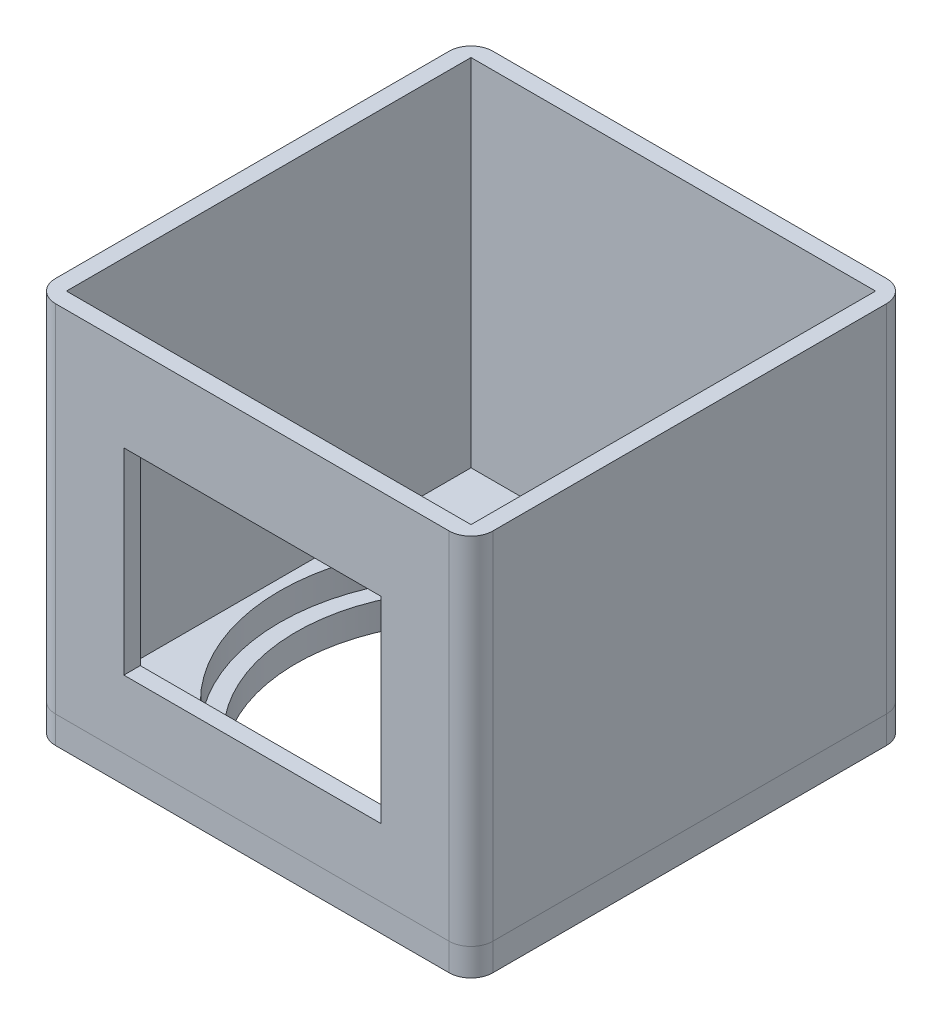
ISO-10303-21;
HEADER;
FILE_DESCRIPTION(('STEP AP214'),'2;1');
FILE_NAME('part.step','',(''),(''),'','','');
FILE_SCHEMA(('AUTOMOTIVE_DESIGN { 1 0 10303 214 1 1 1 1 }'));
ENDSEC;
DATA;
#1=APPLICATION_CONTEXT('core data for automotive mechanical design processes');
#2=APPLICATION_PROTOCOL_DEFINITION('international standard','automotive_design',2000,#1);
#3=PRODUCT_CONTEXT('',#1,'mechanical');
#4=PRODUCT('Part','Part','',(#3));
#5=PRODUCT_RELATED_PRODUCT_CATEGORY('part','',(#4));
#6=PRODUCT_DEFINITION_FORMATION('','',#4);
#7=PRODUCT_DEFINITION_CONTEXT('part definition',#1,'design');
#8=PRODUCT_DEFINITION('design','',#6,#7);
#9=PRODUCT_DEFINITION_SHAPE('','',#8);
#10=(LENGTH_UNIT() NAMED_UNIT(*) SI_UNIT(.MILLI.,.METRE.));
#11=(NAMED_UNIT(*) PLANE_ANGLE_UNIT() SI_UNIT($,.RADIAN.));
#12=(NAMED_UNIT(*) SI_UNIT($,.STERADIAN.) SOLID_ANGLE_UNIT());
#13=UNCERTAINTY_MEASURE_WITH_UNIT(LENGTH_MEASURE(1.E-05),#10,'distance_accuracy_value','');
#14=(GEOMETRIC_REPRESENTATION_CONTEXT(3) GLOBAL_UNCERTAINTY_ASSIGNED_CONTEXT((#13)) GLOBAL_UNIT_ASSIGNED_CONTEXT((#10,
#11,#12)) REPRESENTATION_CONTEXT('',''));
#15=CARTESIAN_POINT('',(0.,0.,0.));
#16=DIRECTION('',(0.,0.,1.));
#17=DIRECTION('',(1.,0.,0.));
#18=AXIS2_PLACEMENT_3D('',#15,#16,#17);
#19=CARTESIAN_POINT('',(0.,75.,0.));
#20=DIRECTION('',(0.,1.,0.));
#21=DIRECTION('',(0.,0.,1.));
#22=AXIS2_PLACEMENT_3D('',#19,#20,#21);
#23=PLANE('',#22);
#24=DIRECTION('',(1.,0.,0.));
#25=VECTOR('',#24,1.);
#26=CARTESIAN_POINT('',(-40.,75.,40.));
#27=LINE('',#26,#25);
#28=CARTESIAN_POINT('',(-36.,75.,40.));
#29=VERTEX_POINT('',#28);
#30=CARTESIAN_POINT('',(36.,75.,40.));
#31=VERTEX_POINT('',#30);
#32=EDGE_CURVE('E271',#29,#31,#27,.T.);
#33=ORIENTED_EDGE('',*,*,#32,.T.);
#34=CARTESIAN_POINT('',(36.,75.,36.));
#35=DIRECTION('',(0.,1.,0.));
#36=DIRECTION('',(0.,0.,1.));
#37=AXIS2_PLACEMENT_3D('',#34,#35,#36);
#38=CIRCLE('',#37,4.);
#39=CARTESIAN_POINT('',(40.,75.,36.));
#40=VERTEX_POINT('',#39);
#41=EDGE_CURVE('E329',#31,#40,#38,.T.);
#42=ORIENTED_EDGE('',*,*,#41,.T.);
#43=DIRECTION('',(0.,0.,-1.));
#44=VECTOR('',#43,1.);
#45=CARTESIAN_POINT('',(40.,75.,-40.));
#46=LINE('',#45,#44);
#47=CARTESIAN_POINT('',(40.,75.,-36.));
#48=VERTEX_POINT('',#47);
#49=EDGE_CURVE('E276',#40,#48,#46,.T.);
#50=ORIENTED_EDGE('',*,*,#49,.T.);
#51=CARTESIAN_POINT('',(36.,75.,-36.));
#52=DIRECTION('',(0.,1.,0.));
#53=DIRECTION('',(0.,0.,1.));
#54=AXIS2_PLACEMENT_3D('',#51,#52,#53);
#55=CIRCLE('',#54,4.);
#56=CARTESIAN_POINT('',(36.,75.,-40.));
#57=VERTEX_POINT('',#56);
#58=EDGE_CURVE('E76',#48,#57,#55,.T.);
#59=ORIENTED_EDGE('',*,*,#58,.T.);
#60=DIRECTION('',(-1.,0.,0.));
#61=VECTOR('',#60,1.);
#62=CARTESIAN_POINT('',(-40.,75.,-40.));
#63=LINE('',#62,#61);
#64=CARTESIAN_POINT('',(-36.,75.,-40.));
#65=VERTEX_POINT('',#64);
#66=EDGE_CURVE('E279',#57,#65,#63,.T.);
#67=ORIENTED_EDGE('',*,*,#66,.T.);
#68=CARTESIAN_POINT('',(-36.,75.,-36.));
#69=DIRECTION('',(0.,1.,0.));
#70=DIRECTION('',(0.,0.,1.));
#71=AXIS2_PLACEMENT_3D('',#68,#69,#70);
#72=CIRCLE('',#71,4.);
#73=CARTESIAN_POINT('',(-40.,75.,-36.));
#74=VERTEX_POINT('',#73);
#75=EDGE_CURVE('E321',#65,#74,#72,.T.);
#76=ORIENTED_EDGE('',*,*,#75,.T.);
#77=DIRECTION('',(0.,0.,1.));
#78=VECTOR('',#77,1.);
#79=CARTESIAN_POINT('',(-40.,75.,-40.));
#80=LINE('',#79,#78);
#81=CARTESIAN_POINT('',(-40.,75.,36.));
#82=VERTEX_POINT('',#81);
#83=EDGE_CURVE('E267',#74,#82,#80,.T.);
#84=ORIENTED_EDGE('',*,*,#83,.T.);
#85=CARTESIAN_POINT('',(-36.,75.,36.));
#86=DIRECTION('',(0.,1.,0.));
#87=DIRECTION('',(0.,0.,1.));
#88=AXIS2_PLACEMENT_3D('',#85,#86,#87);
#89=CIRCLE('',#88,4.);
#90=EDGE_CURVE('E324',#82,#29,#89,.T.);
#91=ORIENTED_EDGE('',*,*,#90,.T.);
#92=EDGE_LOOP('',(#33,#42,#50,#59,#67,#76,#84,#91));
#93=FACE_BOUND('',#92,.T.);
#94=DIRECTION('',(-1.,0.,0.));
#95=VECTOR('',#94,1.);
#96=CARTESIAN_POINT('',(-37.,75.,-37.));
#97=LINE('',#96,#95);
#98=CARTESIAN_POINT('',(37.,75.,-37.));
#99=VERTEX_POINT('',#98);
#100=CARTESIAN_POINT('',(-37.,75.,-37.));
#101=VERTEX_POINT('',#100);
#102=EDGE_CURVE('E227',#99,#101,#97,.T.);
#103=ORIENTED_EDGE('',*,*,#102,.F.);
#104=DIRECTION('',(0.,0.,-1.));
#105=VECTOR('',#104,1.);
#106=CARTESIAN_POINT('',(37.,75.,-37.));
#107=LINE('',#106,#105);
#108=CARTESIAN_POINT('',(37.,75.,37.));
#109=VERTEX_POINT('',#108);
#110=EDGE_CURVE('E224',#109,#99,#107,.T.);
#111=ORIENTED_EDGE('',*,*,#110,.F.);
#112=DIRECTION('',(1.,0.,0.));
#113=VECTOR('',#112,1.);
#114=CARTESIAN_POINT('',(-37.,75.,37.));
#115=LINE('',#114,#113);
#116=CARTESIAN_POINT('',(-37.,75.,37.));
#117=VERTEX_POINT('',#116);
#118=EDGE_CURVE('E235',#117,#109,#115,.T.);
#119=ORIENTED_EDGE('',*,*,#118,.F.);
#120=DIRECTION('',(0.,0.,1.));
#121=VECTOR('',#120,1.);
#122=CARTESIAN_POINT('',(-37.,75.,-37.));
#123=LINE('',#122,#121);
#124=EDGE_CURVE('E231',#101,#117,#123,.T.);
#125=ORIENTED_EDGE('',*,*,#124,.F.);
#126=EDGE_LOOP('',(#103,#111,#119,#125));
#127=FACE_BOUND('',#126,.T.);
#128=ADVANCED_FACE('F53',(#93,#127),#23,.T.);
#129=CARTESIAN_POINT('',(0.,10.,0.));
#130=DIRECTION('',(0.,1.,0.));
#131=DIRECTION('',(0.,0.,1.));
#132=AXIS2_PLACEMENT_3D('',#129,#130,#131);
#133=PLANE('',#132);
#134=DIRECTION('',(0.,0.,-1.));
#135=VECTOR('',#134,1.);
#136=CARTESIAN_POINT('',(40.,10.,-40.));
#137=LINE('',#136,#135);
#138=CARTESIAN_POINT('',(40.,10.,36.));
#139=VERTEX_POINT('',#138);
#140=CARTESIAN_POINT('',(40.,10.,-36.));
#141=VERTEX_POINT('',#140);
#142=EDGE_CURVE('E290',#139,#141,#137,.T.);
#143=ORIENTED_EDGE('',*,*,#142,.F.);
#144=CARTESIAN_POINT('',(36.,9.99999999999999,36.));
#145=DIRECTION('',(0.,1.,0.));
#146=DIRECTION('',(0.,0.,1.));
#147=AXIS2_PLACEMENT_3D('',#144,#145,#146);
#148=CIRCLE('',#147,4.);
#149=CARTESIAN_POINT('',(36.,10.,40.));
#150=VERTEX_POINT('',#149);
#151=EDGE_CURVE('E311',#139,#150,#148,.F.);
#152=ORIENTED_EDGE('',*,*,#151,.T.);
#153=DIRECTION('',(1.,0.,0.));
#154=VECTOR('',#153,1.);
#155=CARTESIAN_POINT('',(-40.,10.,40.));
#156=LINE('',#155,#154);
#157=CARTESIAN_POINT('',(-36.,10.,40.));
#158=VERTEX_POINT('',#157);
#159=EDGE_CURVE('E286',#158,#150,#156,.T.);
#160=ORIENTED_EDGE('',*,*,#159,.F.);
#161=CARTESIAN_POINT('',(-36.,9.99999999999999,36.));
#162=DIRECTION('',(0.,1.,0.));
#163=DIRECTION('',(0.,0.,1.));
#164=AXIS2_PLACEMENT_3D('',#161,#162,#163);
#165=CIRCLE('',#164,4.);
#166=CARTESIAN_POINT('',(-40.,10.,36.));
#167=VERTEX_POINT('',#166);
#168=EDGE_CURVE('E305',#158,#167,#165,.F.);
#169=ORIENTED_EDGE('',*,*,#168,.T.);
#170=DIRECTION('',(0.,0.,1.));
#171=VECTOR('',#170,1.);
#172=CARTESIAN_POINT('',(-40.,10.,-40.));
#173=LINE('',#172,#171);
#174=CARTESIAN_POINT('',(-40.,10.,-36.));
#175=VERTEX_POINT('',#174);
#176=EDGE_CURVE('E266',#175,#167,#173,.T.);
#177=ORIENTED_EDGE('',*,*,#176,.F.);
#178=CARTESIAN_POINT('',(-36.,9.99999999999999,-36.));
#179=DIRECTION('',(0.,1.,0.));
#180=DIRECTION('',(0.,0.,1.));
#181=AXIS2_PLACEMENT_3D('',#178,#179,#180);
#182=CIRCLE('',#181,4.);
#183=CARTESIAN_POINT('',(-36.,10.,-40.));
#184=VERTEX_POINT('',#183);
#185=EDGE_CURVE('E302',#175,#184,#182,.F.);
#186=ORIENTED_EDGE('',*,*,#185,.T.);
#187=DIRECTION('',(-1.,0.,0.));
#188=VECTOR('',#187,1.);
#189=CARTESIAN_POINT('',(-40.,10.,-40.));
#190=LINE('',#189,#188);
#191=CARTESIAN_POINT('',(36.,10.,-40.));
#192=VERTEX_POINT('',#191);
#193=EDGE_CURVE('E272',#192,#184,#190,.T.);
#194=ORIENTED_EDGE('',*,*,#193,.F.);
#195=CARTESIAN_POINT('',(36.,9.99999999999999,-36.));
#196=DIRECTION('',(0.,1.,0.));
#197=DIRECTION('',(0.,0.,1.));
#198=AXIS2_PLACEMENT_3D('',#195,#196,#197);
#199=CIRCLE('',#198,4.);
#200=EDGE_CURVE('E308',#192,#141,#199,.F.);
#201=ORIENTED_EDGE('',*,*,#200,.T.);
#202=EDGE_LOOP('',(#143,#152,#160,#169,#177,#186,#194,#201));
#203=FACE_BOUND('',#202,.T.);
#204=DIRECTION('',(0.,0.,-1.));
#205=VECTOR('',#204,1.);
#206=CARTESIAN_POINT('',(37.,10.,-37.));
#207=LINE('',#206,#205);
#208=CARTESIAN_POINT('',(37.,10.,37.));
#209=VERTEX_POINT('',#208);
#210=CARTESIAN_POINT('',(37.,10.,-37.));
#211=VERTEX_POINT('',#210);
#212=EDGE_CURVE('E223',#209,#211,#207,.T.);
#213=ORIENTED_EDGE('',*,*,#212,.T.);
#214=DIRECTION('',(-1.,0.,0.));
#215=VECTOR('',#214,1.);
#216=CARTESIAN_POINT('',(-37.,10.,-37.));
#217=LINE('',#216,#215);
#218=CARTESIAN_POINT('',(-37.,10.,-37.));
#219=VERTEX_POINT('',#218);
#220=EDGE_CURVE('E242',#211,#219,#217,.T.);
#221=ORIENTED_EDGE('',*,*,#220,.T.);
#222=DIRECTION('',(0.,0.,1.));
#223=VECTOR('',#222,1.);
#224=CARTESIAN_POINT('',(-37.,10.,-37.));
#225=LINE('',#224,#223);
#226=CARTESIAN_POINT('',(-37.,10.,37.));
#227=VERTEX_POINT('',#226);
#228=EDGE_CURVE('E246',#219,#227,#225,.T.);
#229=ORIENTED_EDGE('',*,*,#228,.T.);
#230=DIRECTION('',(1.,0.,0.));
#231=VECTOR('',#230,1.);
#232=CARTESIAN_POINT('',(-37.,10.,37.));
#233=LINE('',#232,#231);
#234=EDGE_CURVE('E228',#227,#209,#233,.T.);
#235=ORIENTED_EDGE('',*,*,#234,.T.);
#236=EDGE_LOOP('',(#213,#221,#229,#235));
#237=FACE_BOUND('',#236,.T.);
#238=ADVANCED_FACE('F349',(#203,#237),#133,.F.);
#239=CARTESIAN_POINT('',(-40.,75.,-40.));
#240=DIRECTION('',(1.,0.,0.));
#241=DIRECTION('',(0.,0.,-1.));
#242=AXIS2_PLACEMENT_3D('',#239,#240,#241);
#243=PLANE('',#242);
#244=ORIENTED_EDGE('',*,*,#176,.T.);
#245=DIRECTION('',(0.,-1.,0.));
#246=VECTOR('',#245,1.);
#247=CARTESIAN_POINT('',(-40.,75.,36.));
#248=LINE('',#247,#246);
#249=EDGE_CURVE('E12',#167,#82,#248,.F.);
#250=ORIENTED_EDGE('',*,*,#249,.T.);
#251=ORIENTED_EDGE('',*,*,#83,.F.);
#252=DIRECTION('',(0.,-1.,0.));
#253=VECTOR('',#252,1.);
#254=CARTESIAN_POINT('',(-40.,75.,-36.));
#255=LINE('',#254,#253);
#256=EDGE_CURVE('E62',#74,#175,#255,.T.);
#257=ORIENTED_EDGE('',*,*,#256,.T.);
#258=EDGE_LOOP('',(#244,#250,#251,#257));
#259=FACE_BOUND('',#258,.T.);
#260=ADVANCED_FACE('F343',(#259),#243,.F.);
#261=CARTESIAN_POINT('',(-40.,75.,40.));
#262=DIRECTION('',(0.,0.,-1.));
#263=DIRECTION('',(-1.,0.,0.));
#264=AXIS2_PLACEMENT_3D('',#261,#262,#263);
#265=PLANE('',#264);
#266=DIRECTION('',(1.,0.,0.));
#267=VECTOR('',#266,1.);
#268=CARTESIAN_POINT('',(-23.5,22.4109445990085,40.));
#269=LINE('',#268,#267);
#270=CARTESIAN_POINT('',(-23.5,22.4109445990085,40.));
#271=VERTEX_POINT('',#270);
#272=CARTESIAN_POINT('',(23.5,22.4109445990085,40.));
#273=VERTEX_POINT('',#272);
#274=EDGE_CURVE('E186',#271,#273,#269,.T.);
#275=ORIENTED_EDGE('',*,*,#274,.F.);
#276=DIRECTION('',(0.,-1.,0.));
#277=VECTOR('',#276,1.);
#278=CARTESIAN_POINT('',(-23.5,58.4109445990085,40.));
#279=LINE('',#278,#277);
#280=CARTESIAN_POINT('',(-23.5,58.4109445990085,40.));
#281=VERTEX_POINT('',#280);
#282=EDGE_CURVE('E210',#281,#271,#279,.T.);
#283=ORIENTED_EDGE('',*,*,#282,.F.);
#284=DIRECTION('',(1.,0.,0.));
#285=VECTOR('',#284,1.);
#286=CARTESIAN_POINT('',(-23.5,58.4109445990085,40.));
#287=LINE('',#286,#285);
#288=CARTESIAN_POINT('',(23.5,58.4109445990085,40.));
#289=VERTEX_POINT('',#288);
#290=EDGE_CURVE('E201',#281,#289,#287,.T.);
#291=ORIENTED_EDGE('',*,*,#290,.T.);
#292=DIRECTION('',(0.,-1.,0.));
#293=VECTOR('',#292,1.);
#294=CARTESIAN_POINT('',(23.5,58.4109445990085,40.));
#295=LINE('',#294,#293);
#296=EDGE_CURVE('E205',#289,#273,#295,.T.);
#297=ORIENTED_EDGE('',*,*,#296,.T.);
#298=EDGE_LOOP('',(#275,#283,#291,#297));
#299=FACE_BOUND('',#298,.T.);
#300=ORIENTED_EDGE('',*,*,#159,.T.);
#301=DIRECTION('',(0.,-1.,0.));
#302=VECTOR('',#301,1.);
#303=CARTESIAN_POINT('',(36.,75.,40.));
#304=LINE('',#303,#302);
#305=EDGE_CURVE('E318',#150,#31,#304,.F.);
#306=ORIENTED_EDGE('',*,*,#305,.T.);
#307=ORIENTED_EDGE('',*,*,#32,.F.);
#308=DIRECTION('',(0.,-1.,0.));
#309=VECTOR('',#308,1.);
#310=CARTESIAN_POINT('',(-36.,75.,40.));
#311=LINE('',#310,#309);
#312=EDGE_CURVE('E314',#29,#158,#311,.T.);
#313=ORIENTED_EDGE('',*,*,#312,.T.);
#314=EDGE_LOOP('',(#300,#306,#307,#313));
#315=FACE_BOUND('',#314,.T.);
#316=ADVANCED_FACE('F359',(#299,#315),#265,.F.);
#317=CARTESIAN_POINT('',(40.,75.,-40.));
#318=DIRECTION('',(-1.,0.,0.));
#319=DIRECTION('',(0.,0.,1.));
#320=AXIS2_PLACEMENT_3D('',#317,#318,#319);
#321=PLANE('',#320);
#322=ORIENTED_EDGE('',*,*,#49,.F.);
#323=DIRECTION('',(0.,-1.,0.));
#324=VECTOR('',#323,1.);
#325=CARTESIAN_POINT('',(40.,75.,36.));
#326=LINE('',#325,#324);
#327=EDGE_CURVE('E298',#40,#139,#326,.T.);
#328=ORIENTED_EDGE('',*,*,#327,.T.);
#329=ORIENTED_EDGE('',*,*,#142,.T.);
#330=DIRECTION('',(0.,-1.,0.));
#331=VECTOR('',#330,1.);
#332=CARTESIAN_POINT('',(40.,75.,-36.));
#333=LINE('',#332,#331);
#334=EDGE_CURVE('E282',#141,#48,#333,.F.);
#335=ORIENTED_EDGE('',*,*,#334,.T.);
#336=EDGE_LOOP('',(#322,#328,#329,#335));
#337=FACE_BOUND('',#336,.T.);
#338=ADVANCED_FACE('F368',(#337),#321,.F.);
#339=CARTESIAN_POINT('',(-40.,75.,-40.));
#340=DIRECTION('',(0.,0.,1.));
#341=DIRECTION('',(1.,0.,0.));
#342=AXIS2_PLACEMENT_3D('',#339,#340,#341);
#343=PLANE('',#342);
#344=ORIENTED_EDGE('',*,*,#66,.F.);
#345=DIRECTION('',(0.,-1.,0.));
#346=VECTOR('',#345,1.);
#347=CARTESIAN_POINT('',(36.,75.,-40.));
#348=LINE('',#347,#346);
#349=EDGE_CURVE('E334',#57,#192,#348,.T.);
#350=ORIENTED_EDGE('',*,*,#349,.T.);
#351=ORIENTED_EDGE('',*,*,#193,.T.);
#352=DIRECTION('',(0.,-1.,0.));
#353=VECTOR('',#352,1.);
#354=CARTESIAN_POINT('',(-36.,75.,-40.));
#355=LINE('',#354,#353);
#356=EDGE_CURVE('E69',#184,#65,#355,.F.);
#357=ORIENTED_EDGE('',*,*,#356,.T.);
#358=EDGE_LOOP('',(#344,#350,#351,#357));
#359=FACE_BOUND('',#358,.T.);
#360=ADVANCED_FACE('F373',(#359),#343,.F.);
#361=CARTESIAN_POINT('',(37.,75.,-37.));
#362=DIRECTION('',(-1.,0.,0.));
#363=DIRECTION('',(0.,0.,1.));
#364=AXIS2_PLACEMENT_3D('',#361,#362,#363);
#365=PLANE('',#364);
#366=ORIENTED_EDGE('',*,*,#212,.F.);
#367=DIRECTION('',(0.,-1.,0.));
#368=VECTOR('',#367,1.);
#369=CARTESIAN_POINT('',(37.,75.,37.));
#370=LINE('',#369,#368);
#371=EDGE_CURVE('E238',#109,#209,#370,.T.);
#372=ORIENTED_EDGE('',*,*,#371,.F.);
#373=ORIENTED_EDGE('',*,*,#110,.T.);
#374=DIRECTION('',(0.,-1.,0.));
#375=VECTOR('',#374,1.);
#376=CARTESIAN_POINT('',(37.,75.,-37.));
#377=LINE('',#376,#375);
#378=EDGE_CURVE('E262',#99,#211,#377,.T.);
#379=ORIENTED_EDGE('',*,*,#378,.T.);
#380=EDGE_LOOP('',(#366,#372,#373,#379));
#381=FACE_BOUND('',#380,.T.);
#382=ADVANCED_FACE('F386',(#381),#365,.T.);
#383=CARTESIAN_POINT('',(-37.,75.,-37.));
#384=DIRECTION('',(0.,0.,1.));
#385=DIRECTION('',(1.,0.,0.));
#386=AXIS2_PLACEMENT_3D('',#383,#384,#385);
#387=PLANE('',#386);
#388=ORIENTED_EDGE('',*,*,#220,.F.);
#389=ORIENTED_EDGE('',*,*,#378,.F.);
#390=ORIENTED_EDGE('',*,*,#102,.T.);
#391=DIRECTION('',(0.,-1.,0.));
#392=VECTOR('',#391,1.);
#393=CARTESIAN_POINT('',(-37.,75.,-37.));
#394=LINE('',#393,#392);
#395=EDGE_CURVE('E259',#101,#219,#394,.T.);
#396=ORIENTED_EDGE('',*,*,#395,.T.);
#397=EDGE_LOOP('',(#388,#389,#390,#396));
#398=FACE_BOUND('',#397,.T.);
#399=ADVANCED_FACE('F479',(#398),#387,.T.);
#400=CARTESIAN_POINT('',(-37.,75.,-37.));
#401=DIRECTION('',(1.,0.,0.));
#402=DIRECTION('',(0.,0.,-1.));
#403=AXIS2_PLACEMENT_3D('',#400,#401,#402);
#404=PLANE('',#403);
#405=ORIENTED_EDGE('',*,*,#228,.F.);
#406=ORIENTED_EDGE('',*,*,#395,.F.);
#407=ORIENTED_EDGE('',*,*,#124,.T.);
#408=DIRECTION('',(0.,-1.,0.));
#409=VECTOR('',#408,1.);
#410=CARTESIAN_POINT('',(-37.,75.,37.));
#411=LINE('',#410,#409);
#412=EDGE_CURVE('E256',#117,#227,#411,.T.);
#413=ORIENTED_EDGE('',*,*,#412,.T.);
#414=EDGE_LOOP('',(#405,#406,#407,#413));
#415=FACE_BOUND('',#414,.T.);
#416=ADVANCED_FACE('F470',(#415),#404,.T.);
#417=CARTESIAN_POINT('',(-37.,75.,37.));
#418=DIRECTION('',(0.,0.,-1.));
#419=DIRECTION('',(-1.,0.,0.));
#420=AXIS2_PLACEMENT_3D('',#417,#418,#419);
#421=PLANE('',#420);
#422=DIRECTION('',(0.,-1.,0.));
#423=VECTOR('',#422,1.);
#424=CARTESIAN_POINT('',(-23.5,58.4109445990085,37.));
#425=LINE('',#424,#423);
#426=CARTESIAN_POINT('',(-23.5,58.4109445990085,37.));
#427=VERTEX_POINT('',#426);
#428=CARTESIAN_POINT('',(-23.5,22.4109445990085,37.));
#429=VERTEX_POINT('',#428);
#430=EDGE_CURVE('E195',#427,#429,#425,.T.);
#431=ORIENTED_EDGE('',*,*,#430,.T.);
#432=DIRECTION('',(1.,0.,0.));
#433=VECTOR('',#432,1.);
#434=CARTESIAN_POINT('',(-23.5,22.4109445990085,37.));
#435=LINE('',#434,#433);
#436=CARTESIAN_POINT('',(23.5,22.4109445990085,37.));
#437=VERTEX_POINT('',#436);
#438=EDGE_CURVE('E180',#429,#437,#435,.T.);
#439=ORIENTED_EDGE('',*,*,#438,.T.);
#440=DIRECTION('',(0.,-1.,0.));
#441=VECTOR('',#440,1.);
#442=CARTESIAN_POINT('',(23.5,58.4109445990085,37.));
#443=LINE('',#442,#441);
#444=CARTESIAN_POINT('',(23.5,58.4109445990085,37.));
#445=VERTEX_POINT('',#444);
#446=EDGE_CURVE('E168',#445,#437,#443,.T.);
#447=ORIENTED_EDGE('',*,*,#446,.F.);
#448=DIRECTION('',(1.,0.,0.));
#449=VECTOR('',#448,1.);
#450=CARTESIAN_POINT('',(-23.5,58.4109445990085,37.));
#451=LINE('',#450,#449);
#452=EDGE_CURVE('E179',#427,#445,#451,.T.);
#453=ORIENTED_EDGE('',*,*,#452,.F.);
#454=EDGE_LOOP('',(#431,#439,#447,#453));
#455=FACE_BOUND('',#454,.T.);
#456=ORIENTED_EDGE('',*,*,#234,.F.);
#457=ORIENTED_EDGE('',*,*,#412,.F.);
#458=ORIENTED_EDGE('',*,*,#118,.T.);
#459=ORIENTED_EDGE('',*,*,#371,.T.);
#460=EDGE_LOOP('',(#456,#457,#458,#459));
#461=FACE_BOUND('',#460,.T.);
#462=ADVANCED_FACE('F192',(#455,#461),#421,.T.);
#463=CARTESIAN_POINT('',(-23.5,58.4109445990085,-40.001));
#464=DIRECTION('',(-1.,0.,0.));
#465=DIRECTION('',(0.,-1.,0.));
#466=AXIS2_PLACEMENT_3D('',#463,#464,#465);
#467=PLANE('',#466);
#468=DIRECTION('',(0.,0.,1.));
#469=VECTOR('',#468,1.);
#470=CARTESIAN_POINT('',(-23.5,58.4109445990085,-40.001));
#471=LINE('',#470,#469);
#472=EDGE_CURVE('E214',#427,#281,#471,.T.);
#473=ORIENTED_EDGE('',*,*,#472,.T.);
#474=ORIENTED_EDGE('',*,*,#282,.T.);
#475=DIRECTION('',(0.,0.,1.));
#476=VECTOR('',#475,1.);
#477=CARTESIAN_POINT('',(-23.5,22.4109445990085,-40.001));
#478=LINE('',#477,#476);
#479=EDGE_CURVE('E189',#429,#271,#478,.T.);
#480=ORIENTED_EDGE('',*,*,#479,.F.);
#481=ORIENTED_EDGE('',*,*,#430,.F.);
#482=EDGE_LOOP('',(#473,#474,#480,#481));
#483=FACE_BOUND('',#482,.T.);
#484=ADVANCED_FACE('F452',(#483),#467,.F.);
#485=CARTESIAN_POINT('',(-23.5,22.4109445990085,-40.001));
#486=DIRECTION('',(0.,-1.,0.));
#487=DIRECTION('',(0.,0.,-1.));
#488=AXIS2_PLACEMENT_3D('',#485,#486,#487);
#489=PLANE('',#488);
#490=ORIENTED_EDGE('',*,*,#479,.T.);
#491=ORIENTED_EDGE('',*,*,#274,.T.);
#492=DIRECTION('',(0.,0.,1.));
#493=VECTOR('',#492,1.);
#494=CARTESIAN_POINT('',(23.5,22.4109445990085,-40.001));
#495=LINE('',#494,#493);
#496=EDGE_CURVE('E171',#437,#273,#495,.T.);
#497=ORIENTED_EDGE('',*,*,#496,.F.);
#498=ORIENTED_EDGE('',*,*,#438,.F.);
#499=EDGE_LOOP('',(#490,#491,#497,#498));
#500=FACE_BOUND('',#499,.T.);
#501=ADVANCED_FACE('F183',(#500),#489,.F.);
#502=CARTESIAN_POINT('',(23.5,58.4109445990085,-40.001));
#503=DIRECTION('',(-1.,0.,0.));
#504=DIRECTION('',(0.,-1.,0.));
#505=AXIS2_PLACEMENT_3D('',#502,#503,#504);
#506=PLANE('',#505);
#507=ORIENTED_EDGE('',*,*,#446,.T.);
#508=ORIENTED_EDGE('',*,*,#496,.T.);
#509=ORIENTED_EDGE('',*,*,#296,.F.);
#510=DIRECTION('',(0.,0.,1.));
#511=VECTOR('',#510,1.);
#512=CARTESIAN_POINT('',(23.5,58.4109445990085,-40.001));
#513=LINE('',#512,#511);
#514=EDGE_CURVE('E174',#445,#289,#513,.T.);
#515=ORIENTED_EDGE('',*,*,#514,.F.);
#516=EDGE_LOOP('',(#507,#508,#509,#515));
#517=FACE_BOUND('',#516,.T.);
#518=ADVANCED_FACE('F170',(#517),#506,.T.);
#519=CARTESIAN_POINT('',(-23.5,58.4109445990085,-40.001));
#520=DIRECTION('',(0.,-1.,0.));
#521=DIRECTION('',(0.,0.,-1.));
#522=AXIS2_PLACEMENT_3D('',#519,#520,#521);
#523=PLANE('',#522);
#524=ORIENTED_EDGE('',*,*,#452,.T.);
#525=ORIENTED_EDGE('',*,*,#514,.T.);
#526=ORIENTED_EDGE('',*,*,#290,.F.);
#527=ORIENTED_EDGE('',*,*,#472,.F.);
#528=EDGE_LOOP('',(#524,#525,#526,#527));
#529=FACE_BOUND('',#528,.T.);
#530=ADVANCED_FACE('F400',(#529),#523,.T.);
#531=CARTESIAN_POINT('',(36.,75.,36.));
#532=DIRECTION('',(0.,-1.,0.));
#533=DIRECTION('',(0.,0.,-1.));
#534=AXIS2_PLACEMENT_3D('',#531,#532,#533);
#535=CYLINDRICAL_SURFACE('',#534,4.);
#536=ORIENTED_EDGE('',*,*,#41,.F.);
#537=ORIENTED_EDGE('',*,*,#305,.F.);
#538=ORIENTED_EDGE('',*,*,#151,.F.);
#539=ORIENTED_EDGE('',*,*,#327,.F.);
#540=EDGE_LOOP('',(#536,#537,#538,#539));
#541=FACE_BOUND('',#540,.T.);
#542=ADVANCED_FACE('F366',(#541),#535,.T.);
#543=CARTESIAN_POINT('',(36.,75.,-36.));
#544=DIRECTION('',(0.,-1.,0.));
#545=DIRECTION('',(0.,0.,-1.));
#546=AXIS2_PLACEMENT_3D('',#543,#544,#545);
#547=CYLINDRICAL_SURFACE('',#546,4.);
#548=ORIENTED_EDGE('',*,*,#58,.F.);
#549=ORIENTED_EDGE('',*,*,#334,.F.);
#550=ORIENTED_EDGE('',*,*,#200,.F.);
#551=ORIENTED_EDGE('',*,*,#349,.F.);
#552=EDGE_LOOP('',(#548,#549,#550,#551));
#553=FACE_BOUND('',#552,.T.);
#554=ADVANCED_FACE('F372',(#553),#547,.T.);
#555=CARTESIAN_POINT('',(-36.,75.,36.));
#556=DIRECTION('',(0.,-1.,0.));
#557=DIRECTION('',(0.,0.,-1.));
#558=AXIS2_PLACEMENT_3D('',#555,#556,#557);
#559=CYLINDRICAL_SURFACE('',#558,4.);
#560=ORIENTED_EDGE('',*,*,#90,.F.);
#561=ORIENTED_EDGE('',*,*,#249,.F.);
#562=ORIENTED_EDGE('',*,*,#168,.F.);
#563=ORIENTED_EDGE('',*,*,#312,.F.);
#564=EDGE_LOOP('',(#560,#561,#562,#563));
#565=FACE_BOUND('',#564,.T.);
#566=ADVANCED_FACE('F356',(#565),#559,.T.);
#567=CARTESIAN_POINT('',(-36.,75.,-36.));
#568=DIRECTION('',(0.,-1.,0.));
#569=DIRECTION('',(0.,0.,-1.));
#570=AXIS2_PLACEMENT_3D('',#567,#568,#569);
#571=CYLINDRICAL_SURFACE('',#570,4.);
#572=ORIENTED_EDGE('',*,*,#75,.F.);
#573=ORIENTED_EDGE('',*,*,#356,.F.);
#574=ORIENTED_EDGE('',*,*,#185,.F.);
#575=ORIENTED_EDGE('',*,*,#256,.F.);
#576=EDGE_LOOP('',(#572,#573,#574,#575));
#577=FACE_BOUND('',#576,.T.);
#578=ADVANCED_FACE('F55',(#577),#571,.T.);
#579=CLOSED_SHELL('',(#128,#238,#260,#316,#338,#360,#382,#399,#416,#462,#484,#501,#518,#530,
#542,#554,#566,#578));
#580=MANIFOLD_SOLID_BREP('B2',#579);
#581=CARTESIAN_POINT('',(0.,10.,0.));
#582=DIRECTION('',(0.,1.,0.));
#583=DIRECTION('',(0.,0.,1.));
#584=AXIS2_PLACEMENT_3D('',#581,#582,#583);
#585=PLANE('',#584);
#586=DIRECTION('',(0.,0.,-1.));
#587=VECTOR('',#586,1.);
#588=CARTESIAN_POINT('',(40.,10.,-40.));
#589=LINE('',#588,#587);
#590=CARTESIAN_POINT('',(40.,10.,36.));
#591=VERTEX_POINT('',#590);
#592=CARTESIAN_POINT('',(40.,10.,-36.));
#593=VERTEX_POINT('',#592);
#594=EDGE_CURVE('E687',#591,#593,#589,.T.);
#595=ORIENTED_EDGE('',*,*,#594,.T.);
#596=CARTESIAN_POINT('',(36.,10.,-36.));
#597=DIRECTION('',(0.,1.,0.));
#598=DIRECTION('',(0.,0.,1.));
#599=AXIS2_PLACEMENT_3D('',#596,#597,#598);
#600=CIRCLE('',#599,4.);
#601=CARTESIAN_POINT('',(36.,10.,-40.));
#602=VERTEX_POINT('',#601);
#603=EDGE_CURVE('E702',#593,#602,#600,.T.);
#604=ORIENTED_EDGE('',*,*,#603,.T.);
#605=DIRECTION('',(-1.,0.,0.));
#606=VECTOR('',#605,1.);
#607=CARTESIAN_POINT('',(-40.,10.,-40.));
#608=LINE('',#607,#606);
#609=CARTESIAN_POINT('',(-36.,10.,-40.));
#610=VERTEX_POINT('',#609);
#611=EDGE_CURVE('E669',#602,#610,#608,.T.);
#612=ORIENTED_EDGE('',*,*,#611,.T.);
#613=CARTESIAN_POINT('',(-36.,10.,-36.));
#614=DIRECTION('',(0.,1.,0.));
#615=DIRECTION('',(0.,0.,1.));
#616=AXIS2_PLACEMENT_3D('',#613,#614,#615);
#617=CIRCLE('',#616,4.);
#618=CARTESIAN_POINT('',(-40.,10.,-36.));
#619=VERTEX_POINT('',#618);
#620=EDGE_CURVE('E697',#610,#619,#617,.T.);
#621=ORIENTED_EDGE('',*,*,#620,.T.);
#622=DIRECTION('',(0.,0.,1.));
#623=VECTOR('',#622,1.);
#624=CARTESIAN_POINT('',(-40.,10.,-40.));
#625=LINE('',#624,#623);
#626=CARTESIAN_POINT('',(-40.,10.,36.));
#627=VERTEX_POINT('',#626);
#628=EDGE_CURVE('E713',#619,#627,#625,.T.);
#629=ORIENTED_EDGE('',*,*,#628,.T.);
#630=CARTESIAN_POINT('',(-36.,10.,36.));
#631=DIRECTION('',(0.,1.,0.));
#632=DIRECTION('',(0.,0.,1.));
#633=AXIS2_PLACEMENT_3D('',#630,#631,#632);
#634=CIRCLE('',#633,4.);
#635=CARTESIAN_POINT('',(-36.,10.,40.));
#636=VERTEX_POINT('',#635);
#637=EDGE_CURVE('E605',#627,#636,#634,.T.);
#638=ORIENTED_EDGE('',*,*,#637,.T.);
#639=DIRECTION('',(1.,0.,0.));
#640=VECTOR('',#639,1.);
#641=CARTESIAN_POINT('',(-40.,10.,40.));
#642=LINE('',#641,#640);
#643=CARTESIAN_POINT('',(36.,10.,40.));
#644=VERTEX_POINT('',#643);
#645=EDGE_CURVE('E688',#636,#644,#642,.T.);
#646=ORIENTED_EDGE('',*,*,#645,.T.);
#647=CARTESIAN_POINT('',(36.,10.,36.));
#648=DIRECTION('',(0.,1.,0.));
#649=DIRECTION('',(0.,0.,1.));
#650=AXIS2_PLACEMENT_3D('',#647,#648,#649);
#651=CIRCLE('',#650,4.);
#652=EDGE_CURVE('E700',#644,#591,#651,.T.);
#653=ORIENTED_EDGE('',*,*,#652,.T.);
#654=EDGE_LOOP('',(#595,#604,#612,#621,#629,#638,#646,#653));
#655=FACE_BOUND('',#654,.T.);
#656=CARTESIAN_POINT('',(0.,10.,0.));
#657=DIRECTION('',(0.,1.,0.));
#658=DIRECTION('',(0.,0.,1.));
#659=AXIS2_PLACEMENT_3D('',#656,#657,#658);
#660=CIRCLE('',#659,35.);
#661=CARTESIAN_POINT('',(0.,10.,35.));
#662=VERTEX_POINT('',#661);
#663=EDGE_CURVE('E682',#662,#662,#660,.T.);
#664=ORIENTED_EDGE('',*,*,#663,.F.);
#665=EDGE_LOOP('',(#664));
#666=FACE_BOUND('',#665,.T.);
#667=ADVANCED_FACE('F583',(#655,#666),#585,.T.);
#668=CARTESIAN_POINT('',(0.,5.,0.));
#669=DIRECTION('',(0.,1.,0.));
#670=DIRECTION('',(0.,0.,1.));
#671=AXIS2_PLACEMENT_3D('',#668,#669,#670);
#672=PLANE('',#671);
#673=DIRECTION('',(-1.,0.,0.));
#674=VECTOR('',#673,1.);
#675=CARTESIAN_POINT('',(-40.,5.,-40.));
#676=LINE('',#675,#674);
#677=CARTESIAN_POINT('',(36.,5.,-40.));
#678=VERTEX_POINT('',#677);
#679=CARTESIAN_POINT('',(-36.,5.,-40.));
#680=VERTEX_POINT('',#679);
#681=EDGE_CURVE('E666',#678,#680,#676,.T.);
#682=ORIENTED_EDGE('',*,*,#681,.F.);
#683=CARTESIAN_POINT('',(36.,5.,-36.));
#684=DIRECTION('',(0.,1.,0.));
#685=DIRECTION('',(0.,0.,1.));
#686=AXIS2_PLACEMENT_3D('',#683,#684,#685);
#687=CIRCLE('',#686,4.);
#688=CARTESIAN_POINT('',(40.,5.,-36.));
#689=VERTEX_POINT('',#688);
#690=EDGE_CURVE('E649',#678,#689,#687,.F.);
#691=ORIENTED_EDGE('',*,*,#690,.T.);
#692=DIRECTION('',(0.,0.,-1.));
#693=VECTOR('',#692,1.);
#694=CARTESIAN_POINT('',(40.,5.,-40.));
#695=LINE('',#694,#693);
#696=CARTESIAN_POINT('',(40.,5.,36.));
#697=VERTEX_POINT('',#696);
#698=EDGE_CURVE('E677',#697,#689,#695,.T.);
#699=ORIENTED_EDGE('',*,*,#698,.F.);
#700=CARTESIAN_POINT('',(36.,5.,36.));
#701=DIRECTION('',(0.,1.,0.));
#702=DIRECTION('',(0.,0.,1.));
#703=AXIS2_PLACEMENT_3D('',#700,#701,#702);
#704=CIRCLE('',#703,4.);
#705=CARTESIAN_POINT('',(36.,5.,40.));
#706=VERTEX_POINT('',#705);
#707=EDGE_CURVE('E660',#697,#706,#704,.F.);
#708=ORIENTED_EDGE('',*,*,#707,.T.);
#709=DIRECTION('',(1.,0.,0.));
#710=VECTOR('',#709,1.);
#711=CARTESIAN_POINT('',(-40.,5.,40.));
#712=LINE('',#711,#710);
#713=CARTESIAN_POINT('',(-36.,5.,40.));
#714=VERTEX_POINT('',#713);
#715=EDGE_CURVE('E680',#714,#706,#712,.T.);
#716=ORIENTED_EDGE('',*,*,#715,.F.);
#717=CARTESIAN_POINT('',(-36.,5.,36.));
#718=DIRECTION('',(0.,1.,0.));
#719=DIRECTION('',(0.,0.,1.));
#720=AXIS2_PLACEMENT_3D('',#717,#718,#719);
#721=CIRCLE('',#720,4.);
#722=CARTESIAN_POINT('',(-40.,5.,36.));
#723=VERTEX_POINT('',#722);
#724=EDGE_CURVE('E691',#714,#723,#721,.F.);
#725=ORIENTED_EDGE('',*,*,#724,.T.);
#726=DIRECTION('',(0.,0.,1.));
#727=VECTOR('',#726,1.);
#728=CARTESIAN_POINT('',(-40.,5.,-40.));
#729=LINE('',#728,#727);
#730=CARTESIAN_POINT('',(-40.,5.,-36.));
#731=VERTEX_POINT('',#730);
#732=EDGE_CURVE('E676',#731,#723,#729,.T.);
#733=ORIENTED_EDGE('',*,*,#732,.F.);
#734=CARTESIAN_POINT('',(-36.,5.,-36.));
#735=DIRECTION('',(0.,1.,0.));
#736=DIRECTION('',(0.,0.,1.));
#737=AXIS2_PLACEMENT_3D('',#734,#735,#736);
#738=CIRCLE('',#737,4.);
#739=EDGE_CURVE('E670',#731,#680,#738,.F.);
#740=ORIENTED_EDGE('',*,*,#739,.T.);
#741=EDGE_LOOP('',(#682,#691,#699,#708,#716,#725,#733,#740));
#742=FACE_BOUND('',#741,.T.);
#743=CARTESIAN_POINT('',(0.,5.,0.));
#744=DIRECTION('',(0.,1.,0.));
#745=DIRECTION('',(0.,0.,1.));
#746=AXIS2_PLACEMENT_3D('',#743,#744,#745);
#747=CIRCLE('',#746,35.);
#748=CARTESIAN_POINT('',(0.,5.,35.));
#749=VERTEX_POINT('',#748);
#750=EDGE_CURVE('E727',#749,#749,#747,.T.);
#751=ORIENTED_EDGE('',*,*,#750,.T.);
#752=EDGE_LOOP('',(#751));
#753=FACE_BOUND('',#752,.T.);
#754=ADVANCED_FACE('F673',(#742,#753),#672,.F.);
#755=CARTESIAN_POINT('',(40.,10.,-40.));
#756=DIRECTION('',(-1.,0.,0.));
#757=DIRECTION('',(0.,0.,1.));
#758=AXIS2_PLACEMENT_3D('',#755,#756,#757);
#759=PLANE('',#758);
#760=ORIENTED_EDGE('',*,*,#698,.T.);
#761=DIRECTION('',(0.,-1.,0.));
#762=VECTOR('',#761,1.);
#763=CARTESIAN_POINT('',(40.,10.,-36.));
#764=LINE('',#763,#762);
#765=EDGE_CURVE('E654',#689,#593,#764,.F.);
#766=ORIENTED_EDGE('',*,*,#765,.T.);
#767=ORIENTED_EDGE('',*,*,#594,.F.);
#768=DIRECTION('',(0.,-1.,0.));
#769=VECTOR('',#768,1.);
#770=CARTESIAN_POINT('',(40.,10.,36.));
#771=LINE('',#770,#769);
#772=EDGE_CURVE('E659',#591,#697,#771,.T.);
#773=ORIENTED_EDGE('',*,*,#772,.T.);
#774=EDGE_LOOP('',(#760,#766,#767,#773));
#775=FACE_BOUND('',#774,.T.);
#776=ADVANCED_FACE('F742',(#775),#759,.F.);
#777=CARTESIAN_POINT('',(-40.,10.,-40.));
#778=DIRECTION('',(0.,0.,1.));
#779=DIRECTION('',(1.,0.,0.));
#780=AXIS2_PLACEMENT_3D('',#777,#778,#779);
#781=PLANE('',#780);
#782=ORIENTED_EDGE('',*,*,#611,.F.);
#783=DIRECTION('',(0.,-1.,0.));
#784=VECTOR('',#783,1.);
#785=CARTESIAN_POINT('',(36.,10.,-40.));
#786=LINE('',#785,#784);
#787=EDGE_CURVE('E653',#602,#678,#786,.T.);
#788=ORIENTED_EDGE('',*,*,#787,.T.);
#789=ORIENTED_EDGE('',*,*,#681,.T.);
#790=DIRECTION('',(0.,-1.,0.));
#791=VECTOR('',#790,1.);
#792=CARTESIAN_POINT('',(-36.,10.,-40.));
#793=LINE('',#792,#791);
#794=EDGE_CURVE('E671',#680,#610,#793,.F.);
#795=ORIENTED_EDGE('',*,*,#794,.T.);
#796=EDGE_LOOP('',(#782,#788,#789,#795));
#797=FACE_BOUND('',#796,.T.);
#798=ADVANCED_FACE('F665',(#797),#781,.F.);
#799=CARTESIAN_POINT('',(-40.,10.,-40.));
#800=DIRECTION('',(1.,0.,0.));
#801=DIRECTION('',(0.,0.,-1.));
#802=AXIS2_PLACEMENT_3D('',#799,#800,#801);
#803=PLANE('',#802);
#804=ORIENTED_EDGE('',*,*,#732,.T.);
#805=DIRECTION('',(0.,-1.,0.));
#806=VECTOR('',#805,1.);
#807=CARTESIAN_POINT('',(-40.,10.,36.));
#808=LINE('',#807,#806);
#809=EDGE_CURVE('E51',#723,#627,#808,.F.);
#810=ORIENTED_EDGE('',*,*,#809,.T.);
#811=ORIENTED_EDGE('',*,*,#628,.F.);
#812=DIRECTION('',(0.,-1.,0.));
#813=VECTOR('',#812,1.);
#814=CARTESIAN_POINT('',(-40.,10.,-36.));
#815=LINE('',#814,#813);
#816=EDGE_CURVE('E591',#619,#731,#815,.T.);
#817=ORIENTED_EDGE('',*,*,#816,.T.);
#818=EDGE_LOOP('',(#804,#810,#811,#817));
#819=FACE_BOUND('',#818,.T.);
#820=ADVANCED_FACE('F711',(#819),#803,.F.);
#821=CARTESIAN_POINT('',(-40.,10.,40.));
#822=DIRECTION('',(0.,0.,-1.));
#823=DIRECTION('',(-1.,0.,0.));
#824=AXIS2_PLACEMENT_3D('',#821,#822,#823);
#825=PLANE('',#824);
#826=ORIENTED_EDGE('',*,*,#715,.T.);
#827=DIRECTION('',(0.,-1.,0.));
#828=VECTOR('',#827,1.);
#829=CARTESIAN_POINT('',(36.,10.,40.));
#830=LINE('',#829,#828);
#831=EDGE_CURVE('E598',#706,#644,#830,.F.);
#832=ORIENTED_EDGE('',*,*,#831,.T.);
#833=ORIENTED_EDGE('',*,*,#645,.F.);
#834=DIRECTION('',(0.,-1.,0.));
#835=VECTOR('',#834,1.);
#836=CARTESIAN_POINT('',(-36.,10.,40.));
#837=LINE('',#836,#835);
#838=EDGE_CURVE('E704',#636,#714,#837,.T.);
#839=ORIENTED_EDGE('',*,*,#838,.T.);
#840=EDGE_LOOP('',(#826,#832,#833,#839));
#841=FACE_BOUND('',#840,.T.);
#842=ADVANCED_FACE('F720',(#841),#825,.F.);
#843=CARTESIAN_POINT('',(0.,10.,0.));
#844=DIRECTION('',(0.,-1.,0.));
#845=DIRECTION('',(0.,0.,-1.));
#846=AXIS2_PLACEMENT_3D('',#843,#844,#845);
#847=CYLINDRICAL_SURFACE('',#846,35.);
#848=ORIENTED_EDGE('',*,*,#663,.T.);
#849=EDGE_LOOP('',(#848));
#850=FACE_BOUND('',#849,.T.);
#851=ORIENTED_EDGE('',*,*,#750,.F.);
#852=EDGE_LOOP('',(#851));
#853=FACE_BOUND('',#852,.T.);
#854=ADVANCED_FACE('F733',(#850,#853),#847,.F.);
#855=CARTESIAN_POINT('',(36.,10.,-36.));
#856=DIRECTION('',(0.,-1.,0.));
#857=DIRECTION('',(0.,0.,-1.));
#858=AXIS2_PLACEMENT_3D('',#855,#856,#857);
#859=CYLINDRICAL_SURFACE('',#858,4.);
#860=ORIENTED_EDGE('',*,*,#603,.F.);
#861=ORIENTED_EDGE('',*,*,#765,.F.);
#862=ORIENTED_EDGE('',*,*,#690,.F.);
#863=ORIENTED_EDGE('',*,*,#787,.F.);
#864=EDGE_LOOP('',(#860,#861,#862,#863));
#865=FACE_BOUND('',#864,.T.);
#866=ADVANCED_FACE('F652',(#865),#859,.T.);
#867=CARTESIAN_POINT('',(36.,10.,36.));
#868=DIRECTION('',(0.,-1.,0.));
#869=DIRECTION('',(0.,0.,-1.));
#870=AXIS2_PLACEMENT_3D('',#867,#868,#869);
#871=CYLINDRICAL_SURFACE('',#870,4.);
#872=ORIENTED_EDGE('',*,*,#652,.F.);
#873=ORIENTED_EDGE('',*,*,#831,.F.);
#874=ORIENTED_EDGE('',*,*,#707,.F.);
#875=ORIENTED_EDGE('',*,*,#772,.F.);
#876=EDGE_LOOP('',(#872,#873,#874,#875));
#877=FACE_BOUND('',#876,.T.);
#878=ADVANCED_FACE('F757',(#877),#871,.T.);
#879=CARTESIAN_POINT('',(-36.,10.,36.));
#880=DIRECTION('',(0.,-1.,0.));
#881=DIRECTION('',(0.,0.,-1.));
#882=AXIS2_PLACEMENT_3D('',#879,#880,#881);
#883=CYLINDRICAL_SURFACE('',#882,4.);
#884=ORIENTED_EDGE('',*,*,#637,.F.);
#885=ORIENTED_EDGE('',*,*,#809,.F.);
#886=ORIENTED_EDGE('',*,*,#724,.F.);
#887=ORIENTED_EDGE('',*,*,#838,.F.);
#888=EDGE_LOOP('',(#884,#885,#886,#887));
#889=FACE_BOUND('',#888,.T.);
#890=ADVANCED_FACE('F719',(#889),#883,.T.);
#891=CARTESIAN_POINT('',(-36.,10.,-36.));
#892=DIRECTION('',(0.,-1.,0.));
#893=DIRECTION('',(0.,0.,-1.));
#894=AXIS2_PLACEMENT_3D('',#891,#892,#893);
#895=CYLINDRICAL_SURFACE('',#894,4.);
#896=ORIENTED_EDGE('',*,*,#620,.F.);
#897=ORIENTED_EDGE('',*,*,#794,.F.);
#898=ORIENTED_EDGE('',*,*,#739,.F.);
#899=ORIENTED_EDGE('',*,*,#816,.F.);
#900=EDGE_LOOP('',(#896,#897,#898,#899));
#901=FACE_BOUND('',#900,.T.);
#902=ADVANCED_FACE('F585',(#901),#895,.T.);
#903=CLOSED_SHELL('',(#667,#754,#776,#798,#820,#842,#854,#866,#878,#890,#902));
#904=MANIFOLD_SOLID_BREP('B6',#903);
#905=CARTESIAN_POINT('',(0.,5.,0.));
#906=DIRECTION('',(0.,1.,0.));
#907=DIRECTION('',(0.,0.,1.));
#908=AXIS2_PLACEMENT_3D('',#905,#906,#907);
#909=PLANE('',#908);
#910=CARTESIAN_POINT('',(0.,5.,0.));
#911=DIRECTION('',(0.,1.,0.));
#912=DIRECTION('',(0.,0.,1.));
#913=AXIS2_PLACEMENT_3D('',#910,#911,#912);
#914=CIRCLE('',#913,35.);
#915=CARTESIAN_POINT('',(0.,5.,35.));
#916=VERTEX_POINT('',#915);
#917=EDGE_CURVE('E582',#916,#916,#914,.T.);
#918=ORIENTED_EDGE('',*,*,#917,.T.);
#919=EDGE_LOOP('',(#918));
#920=FACE_BOUND('',#919,.T.);
#921=CARTESIAN_POINT('',(0.,5.,0.));
#922=DIRECTION('',(0.,1.,0.));
#923=DIRECTION('',(0.,0.,1.));
#924=AXIS2_PLACEMENT_3D('',#921,#922,#923);
#925=CIRCLE('',#924,32.);
#926=CARTESIAN_POINT('',(0.,5.,32.));
#927=VERTEX_POINT('',#926);
#928=EDGE_CURVE('E864',#927,#927,#925,.T.);
#929=ORIENTED_EDGE('',*,*,#928,.F.);
#930=EDGE_LOOP('',(#929));
#931=FACE_BOUND('',#930,.T.);
#932=ADVANCED_FACE('F853',(#920,#931),#909,.T.);
#933=CARTESIAN_POINT('',(0.,0.,0.));
#934=DIRECTION('',(0.,1.,0.));
#935=DIRECTION('',(0.,0.,1.));
#936=AXIS2_PLACEMENT_3D('',#933,#934,#935);
#937=PLANE('',#936);
#938=CARTESIAN_POINT('',(0.,0.,0.));
#939=DIRECTION('',(0.,1.,0.));
#940=DIRECTION('',(0.,0.,1.));
#941=AXIS2_PLACEMENT_3D('',#938,#939,#940);
#942=CIRCLE('',#941,35.);
#943=CARTESIAN_POINT('',(0.,0.,35.));
#944=VERTEX_POINT('',#943);
#945=EDGE_CURVE('E857',#944,#944,#942,.T.);
#946=ORIENTED_EDGE('',*,*,#945,.F.);
#947=EDGE_LOOP('',(#946));
#948=FACE_BOUND('',#947,.T.);
#949=CARTESIAN_POINT('',(0.,0.,0.));
#950=DIRECTION('',(0.,1.,0.));
#951=DIRECTION('',(0.,0.,1.));
#952=AXIS2_PLACEMENT_3D('',#949,#950,#951);
#953=CIRCLE('',#952,32.);
#954=CARTESIAN_POINT('',(0.,0.,32.));
#955=VERTEX_POINT('',#954);
#956=EDGE_CURVE('E866',#955,#955,#953,.T.);
#957=ORIENTED_EDGE('',*,*,#956,.T.);
#958=EDGE_LOOP('',(#957));
#959=FACE_BOUND('',#958,.T.);
#960=ADVANCED_FACE('F876',(#948,#959),#937,.F.);
#961=CARTESIAN_POINT('',(0.,5.,0.));
#962=DIRECTION('',(0.,-1.,0.));
#963=DIRECTION('',(0.,0.,-1.));
#964=AXIS2_PLACEMENT_3D('',#961,#962,#963);
#965=CYLINDRICAL_SURFACE('',#964,35.);
#966=ORIENTED_EDGE('',*,*,#917,.F.);
#967=EDGE_LOOP('',(#966));
#968=FACE_BOUND('',#967,.T.);
#969=ORIENTED_EDGE('',*,*,#945,.T.);
#970=EDGE_LOOP('',(#969));
#971=FACE_BOUND('',#970,.T.);
#972=ADVANCED_FACE('F855',(#968,#971),#965,.T.);
#973=CARTESIAN_POINT('',(0.,5.,0.));
#974=DIRECTION('',(0.,-1.,0.));
#975=DIRECTION('',(0.,0.,-1.));
#976=AXIS2_PLACEMENT_3D('',#973,#974,#975);
#977=CYLINDRICAL_SURFACE('',#976,32.);
#978=ORIENTED_EDGE('',*,*,#928,.T.);
#979=EDGE_LOOP('',(#978));
#980=FACE_BOUND('',#979,.T.);
#981=ORIENTED_EDGE('',*,*,#956,.F.);
#982=EDGE_LOOP('',(#981));
#983=FACE_BOUND('',#982,.T.);
#984=ADVANCED_FACE('F872',(#980,#983),#977,.F.);
#985=CLOSED_SHELL('',(#932,#960,#972,#984));
#986=MANIFOLD_SOLID_BREP('B45',#985);
#987=ADVANCED_BREP_SHAPE_REPRESENTATION('',(#18,#580,#904,#986),#14);
#988=SHAPE_DEFINITION_REPRESENTATION(#9,#987);
ENDSEC;
END-ISO-10303-21;
